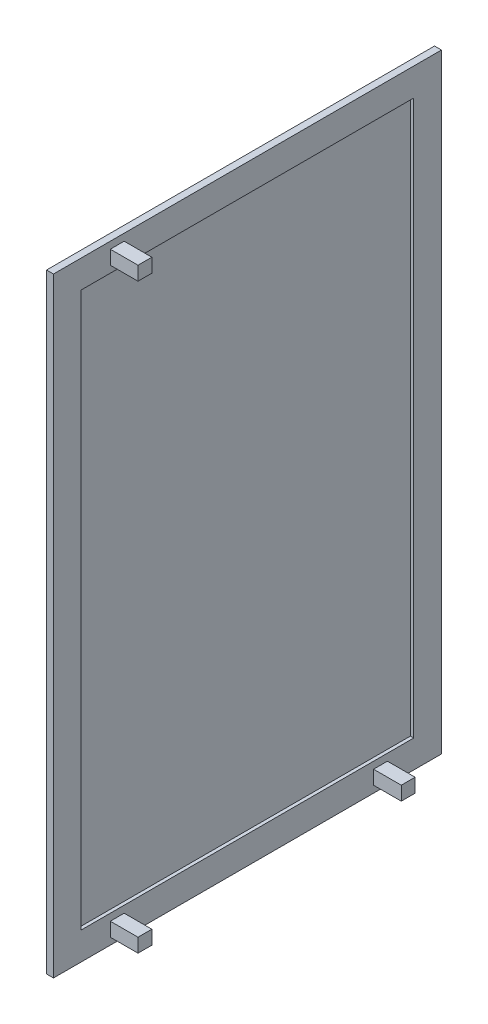
ISO-10303-21;
HEADER;
FILE_DESCRIPTION(('STEP AP214'),'2;1');
FILE_NAME('part.step','',(''),(''),'','','');
FILE_SCHEMA(('AUTOMOTIVE_DESIGN { 1 0 10303 214 1 1 1 1 }'));
ENDSEC;
DATA;
#1=APPLICATION_CONTEXT('core data for automotive mechanical design processes');
#2=APPLICATION_PROTOCOL_DEFINITION('international standard','automotive_design',2000,#1);
#3=PRODUCT_CONTEXT('',#1,'mechanical');
#4=PRODUCT('Part','Part','',(#3));
#5=PRODUCT_RELATED_PRODUCT_CATEGORY('part','',(#4));
#6=PRODUCT_DEFINITION_FORMATION('','',#4);
#7=PRODUCT_DEFINITION_CONTEXT('part definition',#1,'design');
#8=PRODUCT_DEFINITION('design','',#6,#7);
#9=PRODUCT_DEFINITION_SHAPE('','',#8);
#10=(LENGTH_UNIT() NAMED_UNIT(*) SI_UNIT(.MILLI.,.METRE.));
#11=(NAMED_UNIT(*) PLANE_ANGLE_UNIT() SI_UNIT($,.RADIAN.));
#12=(NAMED_UNIT(*) SI_UNIT($,.STERADIAN.) SOLID_ANGLE_UNIT());
#13=UNCERTAINTY_MEASURE_WITH_UNIT(LENGTH_MEASURE(1.E-05),#10,'distance_accuracy_value','');
#14=(GEOMETRIC_REPRESENTATION_CONTEXT(3) GLOBAL_UNCERTAINTY_ASSIGNED_CONTEXT((#13)) GLOBAL_UNIT_ASSIGNED_CONTEXT((#10,
#11,#12)) REPRESENTATION_CONTEXT('',''));
#15=CARTESIAN_POINT('',(0.,0.,0.));
#16=DIRECTION('',(0.,0.,1.));
#17=DIRECTION('',(1.,0.,0.));
#18=AXIS2_PLACEMENT_3D('',#15,#16,#17);
#19=CARTESIAN_POINT('',(1.25,0.,0.));
#20=DIRECTION('',(-1.,0.,0.));
#21=DIRECTION('',(0.,0.,1.));
#22=AXIS2_PLACEMENT_3D('',#19,#20,#21);
#23=PLANE('',#22);
#24=DIRECTION('',(0.,0.,-1.));
#25=VECTOR('',#24,1.);
#26=CARTESIAN_POINT('',(1.25,5.,-5.00000000000001));
#27=LINE('',#26,#25);
#28=CARTESIAN_POINT('',(1.25,5.,-5.00000000000001));
#29=VERTEX_POINT('',#28);
#30=CARTESIAN_POINT('',(1.25,5.,-65.));
#31=VERTEX_POINT('',#30);
#32=EDGE_CURVE('E199',#29,#31,#27,.T.);
#33=ORIENTED_EDGE('',*,*,#32,.F.);
#34=DIRECTION('',(0.,-1.,0.));
#35=VECTOR('',#34,1.);
#36=CARTESIAN_POINT('',(1.25,105.,-5.));
#37=LINE('',#36,#35);
#38=CARTESIAN_POINT('',(1.25,105.,-5.));
#39=VERTEX_POINT('',#38);
#40=EDGE_CURVE('E48',#39,#29,#37,.T.);
#41=ORIENTED_EDGE('',*,*,#40,.F.);
#42=DIRECTION('',(0.,0.,1.));
#43=VECTOR('',#42,1.);
#44=CARTESIAN_POINT('',(1.25,105.,-5.));
#45=LINE('',#44,#43);
#46=CARTESIAN_POINT('',(1.25,105.,-65.));
#47=VERTEX_POINT('',#46);
#48=EDGE_CURVE('E190',#47,#39,#45,.T.);
#49=ORIENTED_EDGE('',*,*,#48,.F.);
#50=DIRECTION('',(0.,1.,0.));
#51=VECTOR('',#50,1.);
#52=CARTESIAN_POINT('',(1.25,105.,-65.));
#53=LINE('',#52,#51);
#54=EDGE_CURVE('E193',#31,#47,#53,.T.);
#55=ORIENTED_EDGE('',*,*,#54,.F.);
#56=EDGE_LOOP('',(#33,#41,#49,#55));
#57=FACE_BOUND('',#56,.T.);
#58=DIRECTION('',(0.,-1.,0.));
#59=VECTOR('',#58,1.);
#60=CARTESIAN_POINT('',(1.25,3.75,-10.25));
#61=LINE('',#60,#59);
#62=CARTESIAN_POINT('',(1.25,3.75,-10.25));
#63=VERTEX_POINT('',#62);
#64=CARTESIAN_POINT('',(1.25,1.25,-10.25));
#65=VERTEX_POINT('',#64);
#66=EDGE_CURVE('E238',#63,#65,#61,.T.);
#67=ORIENTED_EDGE('',*,*,#66,.F.);
#68=DIRECTION('',(0.,0.,1.));
#69=VECTOR('',#68,1.);
#70=CARTESIAN_POINT('',(1.25,3.75,-10.25));
#71=LINE('',#70,#69);
#72=CARTESIAN_POINT('',(1.25,3.75,-12.75));
#73=VERTEX_POINT('',#72);
#74=EDGE_CURVE('E243',#73,#63,#71,.T.);
#75=ORIENTED_EDGE('',*,*,#74,.F.);
#76=DIRECTION('',(0.,1.,0.));
#77=VECTOR('',#76,1.);
#78=CARTESIAN_POINT('',(1.25,3.75,-12.75));
#79=LINE('',#78,#77);
#80=CARTESIAN_POINT('',(1.25,1.25,-12.75));
#81=VERTEX_POINT('',#80);
#82=EDGE_CURVE('E255',#81,#73,#79,.T.);
#83=ORIENTED_EDGE('',*,*,#82,.F.);
#84=DIRECTION('',(0.,0.,-1.));
#85=VECTOR('',#84,1.);
#86=CARTESIAN_POINT('',(1.25,1.25,-10.25));
#87=LINE('',#86,#85);
#88=EDGE_CURVE('E252',#65,#81,#87,.T.);
#89=ORIENTED_EDGE('',*,*,#88,.F.);
#90=EDGE_LOOP('',(#67,#75,#83,#89));
#91=FACE_BOUND('',#90,.T.);
#92=DIRECTION('',(0.,-1.,0.));
#93=VECTOR('',#92,1.);
#94=CARTESIAN_POINT('',(1.25,0.,0.));
#95=LINE('',#94,#93);
#96=CARTESIAN_POINT('',(1.25,110.,0.));
#97=VERTEX_POINT('',#96);
#98=CARTESIAN_POINT('',(1.25,0.,0.));
#99=VERTEX_POINT('',#98);
#100=EDGE_CURVE('E305',#97,#99,#95,.T.);
#101=ORIENTED_EDGE('',*,*,#100,.T.);
#102=DIRECTION('',(0.,0.,-1.));
#103=VECTOR('',#102,1.);
#104=CARTESIAN_POINT('',(1.25,0.,0.));
#105=LINE('',#104,#103);
#106=CARTESIAN_POINT('',(1.25,0.,-70.));
#107=VERTEX_POINT('',#106);
#108=EDGE_CURVE('E308',#99,#107,#105,.T.);
#109=ORIENTED_EDGE('',*,*,#108,.T.);
#110=DIRECTION('',(0.,1.,0.));
#111=VECTOR('',#110,1.);
#112=CARTESIAN_POINT('',(1.25,0.,-70.));
#113=LINE('',#112,#111);
#114=CARTESIAN_POINT('',(1.25,110.,-70.));
#115=VERTEX_POINT('',#114);
#116=EDGE_CURVE('E311',#107,#115,#113,.T.);
#117=ORIENTED_EDGE('',*,*,#116,.T.);
#118=DIRECTION('',(0.,0.,1.));
#119=VECTOR('',#118,1.);
#120=CARTESIAN_POINT('',(1.25,110.,0.));
#121=LINE('',#120,#119);
#122=EDGE_CURVE('E313',#115,#97,#121,.T.);
#123=ORIENTED_EDGE('',*,*,#122,.T.);
#124=EDGE_LOOP('',(#101,#109,#117,#123));
#125=FACE_BOUND('',#124,.T.);
#126=DIRECTION('',(0.,-1.,0.));
#127=VECTOR('',#126,1.);
#128=CARTESIAN_POINT('',(1.25,108.75,-10.25));
#129=LINE('',#128,#127);
#130=CARTESIAN_POINT('',(1.25,108.75,-10.25));
#131=VERTEX_POINT('',#130);
#132=CARTESIAN_POINT('',(1.25,106.25,-10.25));
#133=VERTEX_POINT('',#132);
#134=EDGE_CURVE('E271',#131,#133,#129,.T.);
#135=ORIENTED_EDGE('',*,*,#134,.F.);
#136=DIRECTION('',(0.,0.,1.));
#137=VECTOR('',#136,1.);
#138=CARTESIAN_POINT('',(1.25,108.75,-10.25));
#139=LINE('',#138,#137);
#140=CARTESIAN_POINT('',(1.25,108.75,-12.75));
#141=VERTEX_POINT('',#140);
#142=EDGE_CURVE('E276',#141,#131,#139,.T.);
#143=ORIENTED_EDGE('',*,*,#142,.F.);
#144=DIRECTION('',(0.,1.,0.));
#145=VECTOR('',#144,1.);
#146=CARTESIAN_POINT('',(1.25,108.75,-12.75));
#147=LINE('',#146,#145);
#148=CARTESIAN_POINT('',(1.25,106.25,-12.75));
#149=VERTEX_POINT('',#148);
#150=EDGE_CURVE('E288',#149,#141,#147,.T.);
#151=ORIENTED_EDGE('',*,*,#150,.F.);
#152=DIRECTION('',(0.,0.,-1.));
#153=VECTOR('',#152,1.);
#154=CARTESIAN_POINT('',(1.25,106.25,-10.25));
#155=LINE('',#154,#153);
#156=EDGE_CURVE('E285',#133,#149,#155,.T.);
#157=ORIENTED_EDGE('',*,*,#156,.F.);
#158=EDGE_LOOP('',(#135,#143,#151,#157));
#159=FACE_BOUND('',#158,.T.);
#160=DIRECTION('',(0.,-1.,0.));
#161=VECTOR('',#160,1.);
#162=CARTESIAN_POINT('',(1.25,3.75,-57.75));
#163=LINE('',#162,#161);
#164=CARTESIAN_POINT('',(1.25,3.75,-57.75));
#165=VERTEX_POINT('',#164);
#166=CARTESIAN_POINT('',(1.25,1.25,-57.75));
#167=VERTEX_POINT('',#166);
#168=EDGE_CURVE('E205',#165,#167,#163,.T.);
#169=ORIENTED_EDGE('',*,*,#168,.F.);
#170=DIRECTION('',(0.,0.,1.));
#171=VECTOR('',#170,1.);
#172=CARTESIAN_POINT('',(1.25,3.75,-57.75));
#173=LINE('',#172,#171);
#174=CARTESIAN_POINT('',(1.25,3.75,-60.25));
#175=VERTEX_POINT('',#174);
#176=EDGE_CURVE('E213',#175,#165,#173,.T.);
#177=ORIENTED_EDGE('',*,*,#176,.F.);
#178=DIRECTION('',(0.,1.,0.));
#179=VECTOR('',#178,1.);
#180=CARTESIAN_POINT('',(1.25,3.75,-60.25));
#181=LINE('',#180,#179);
#182=CARTESIAN_POINT('',(1.25,1.25,-60.25));
#183=VERTEX_POINT('',#182);
#184=EDGE_CURVE('E223',#183,#175,#181,.T.);
#185=ORIENTED_EDGE('',*,*,#184,.F.);
#186=DIRECTION('',(0.,0.,-1.));
#187=VECTOR('',#186,1.);
#188=CARTESIAN_POINT('',(1.25,1.25,-57.75));
#189=LINE('',#188,#187);
#190=EDGE_CURVE('E56',#167,#183,#189,.T.);
#191=ORIENTED_EDGE('',*,*,#190,.F.);
#192=EDGE_LOOP('',(#169,#177,#185,#191));
#193=FACE_BOUND('',#192,.T.);
#194=ADVANCED_FACE('F33',(#57,#91,#125,#159,#193),#23,.F.);
#195=CARTESIAN_POINT('',(1.25,0.,0.));
#196=DIRECTION('',(0.,0.,-1.));
#197=DIRECTION('',(-1.,0.,0.));
#198=AXIS2_PLACEMENT_3D('',#195,#196,#197);
#199=PLANE('',#198);
#200=DIRECTION('',(0.,-1.,0.));
#201=VECTOR('',#200,1.);
#202=CARTESIAN_POINT('',(0.,0.,0.));
#203=LINE('',#202,#201);
#204=CARTESIAN_POINT('',(0.,110.,0.));
#205=VERTEX_POINT('',#204);
#206=CARTESIAN_POINT('',(0.,0.,0.));
#207=VERTEX_POINT('',#206);
#208=EDGE_CURVE('E304',#205,#207,#203,.T.);
#209=ORIENTED_EDGE('',*,*,#208,.T.);
#210=DIRECTION('',(-1.,0.,0.));
#211=VECTOR('',#210,1.);
#212=CARTESIAN_POINT('',(1.25,0.,0.));
#213=LINE('',#212,#211);
#214=EDGE_CURVE('E11',#99,#207,#213,.T.);
#215=ORIENTED_EDGE('',*,*,#214,.F.);
#216=ORIENTED_EDGE('',*,*,#100,.F.);
#217=DIRECTION('',(-1.,0.,0.));
#218=VECTOR('',#217,1.);
#219=CARTESIAN_POINT('',(1.25,110.,0.));
#220=LINE('',#219,#218);
#221=EDGE_CURVE('E315',#97,#205,#220,.T.);
#222=ORIENTED_EDGE('',*,*,#221,.T.);
#223=EDGE_LOOP('',(#209,#215,#216,#222));
#224=FACE_BOUND('',#223,.T.);
#225=ADVANCED_FACE('F35',(#224),#199,.F.);
#226=CARTESIAN_POINT('',(1.25,0.,0.));
#227=DIRECTION('',(0.,1.,0.));
#228=DIRECTION('',(0.,0.,1.));
#229=AXIS2_PLACEMENT_3D('',#226,#227,#228);
#230=PLANE('',#229);
#231=DIRECTION('',(0.,0.,-1.));
#232=VECTOR('',#231,1.);
#233=CARTESIAN_POINT('',(0.,0.,0.));
#234=LINE('',#233,#232);
#235=CARTESIAN_POINT('',(0.,0.,-70.));
#236=VERTEX_POINT('',#235);
#237=EDGE_CURVE('E318',#207,#236,#234,.T.);
#238=ORIENTED_EDGE('',*,*,#237,.T.);
#239=DIRECTION('',(-1.,0.,0.));
#240=VECTOR('',#239,1.);
#241=CARTESIAN_POINT('',(1.25,0.,-70.));
#242=LINE('',#241,#240);
#243=EDGE_CURVE('E41',#107,#236,#242,.T.);
#244=ORIENTED_EDGE('',*,*,#243,.F.);
#245=ORIENTED_EDGE('',*,*,#108,.F.);
#246=ORIENTED_EDGE('',*,*,#214,.T.);
#247=EDGE_LOOP('',(#238,#244,#245,#246));
#248=FACE_BOUND('',#247,.T.);
#249=ADVANCED_FACE('F348',(#248),#230,.F.);
#250=CARTESIAN_POINT('',(1.25,0.,-70.));
#251=DIRECTION('',(0.,0.,1.));
#252=DIRECTION('',(1.,0.,0.));
#253=AXIS2_PLACEMENT_3D('',#250,#251,#252);
#254=PLANE('',#253);
#255=DIRECTION('',(0.,1.,0.));
#256=VECTOR('',#255,1.);
#257=CARTESIAN_POINT('',(0.,0.,-70.));
#258=LINE('',#257,#256);
#259=CARTESIAN_POINT('',(0.,110.,-70.));
#260=VERTEX_POINT('',#259);
#261=EDGE_CURVE('E320',#236,#260,#258,.T.);
#262=ORIENTED_EDGE('',*,*,#261,.T.);
#263=DIRECTION('',(-1.,0.,0.));
#264=VECTOR('',#263,1.);
#265=CARTESIAN_POINT('',(1.25,110.,-70.));
#266=LINE('',#265,#264);
#267=EDGE_CURVE('E325',#115,#260,#266,.T.);
#268=ORIENTED_EDGE('',*,*,#267,.F.);
#269=ORIENTED_EDGE('',*,*,#116,.F.);
#270=ORIENTED_EDGE('',*,*,#243,.T.);
#271=EDGE_LOOP('',(#262,#268,#269,#270));
#272=FACE_BOUND('',#271,.T.);
#273=ADVANCED_FACE('F332',(#272),#254,.F.);
#274=CARTESIAN_POINT('',(1.25,110.,0.));
#275=DIRECTION('',(0.,-1.,0.));
#276=DIRECTION('',(0.,0.,-1.));
#277=AXIS2_PLACEMENT_3D('',#274,#275,#276);
#278=PLANE('',#277);
#279=DIRECTION('',(0.,0.,1.));
#280=VECTOR('',#279,1.);
#281=CARTESIAN_POINT('',(0.,110.,0.));
#282=LINE('',#281,#280);
#283=EDGE_CURVE('E309',#260,#205,#282,.T.);
#284=ORIENTED_EDGE('',*,*,#283,.T.);
#285=ORIENTED_EDGE('',*,*,#221,.F.);
#286=ORIENTED_EDGE('',*,*,#122,.F.);
#287=ORIENTED_EDGE('',*,*,#267,.T.);
#288=EDGE_LOOP('',(#284,#285,#286,#287));
#289=FACE_BOUND('',#288,.T.);
#290=ADVANCED_FACE('F341',(#289),#278,.F.);
#291=CARTESIAN_POINT('',(0.,0.,0.));
#292=DIRECTION('',(-1.,0.,0.));
#293=DIRECTION('',(0.,0.,1.));
#294=AXIS2_PLACEMENT_3D('',#291,#292,#293);
#295=PLANE('',#294);
#296=ORIENTED_EDGE('',*,*,#208,.F.);
#297=ORIENTED_EDGE('',*,*,#283,.F.);
#298=ORIENTED_EDGE('',*,*,#261,.F.);
#299=ORIENTED_EDGE('',*,*,#237,.F.);
#300=EDGE_LOOP('',(#296,#297,#298,#299));
#301=FACE_BOUND('',#300,.T.);
#302=ADVANCED_FACE('F338',(#301),#295,.T.);
#303=CARTESIAN_POINT('',(6.25,108.75,-10.25));
#304=DIRECTION('',(0.,0.,-1.));
#305=DIRECTION('',(0.,1.,0.));
#306=AXIS2_PLACEMENT_3D('',#303,#304,#305);
#307=PLANE('',#306);
#308=ORIENTED_EDGE('',*,*,#134,.T.);
#309=DIRECTION('',(-1.,0.,0.));
#310=VECTOR('',#309,1.);
#311=CARTESIAN_POINT('',(6.25,106.25,-10.25));
#312=LINE('',#311,#310);
#313=CARTESIAN_POINT('',(6.25,106.25,-10.25));
#314=VERTEX_POINT('',#313);
#315=EDGE_CURVE('E301',#314,#133,#312,.T.);
#316=ORIENTED_EDGE('',*,*,#315,.F.);
#317=DIRECTION('',(0.,-1.,0.));
#318=VECTOR('',#317,1.);
#319=CARTESIAN_POINT('',(6.25,108.75,-10.25));
#320=LINE('',#319,#318);
#321=CARTESIAN_POINT('',(6.25,108.75,-10.25));
#322=VERTEX_POINT('',#321);
#323=EDGE_CURVE('E272',#322,#314,#320,.T.);
#324=ORIENTED_EDGE('',*,*,#323,.F.);
#325=DIRECTION('',(-1.,0.,0.));
#326=VECTOR('',#325,1.);
#327=CARTESIAN_POINT('',(6.25,108.75,-10.25));
#328=LINE('',#327,#326);
#329=EDGE_CURVE('E282',#322,#131,#328,.T.);
#330=ORIENTED_EDGE('',*,*,#329,.T.);
#331=EDGE_LOOP('',(#308,#316,#324,#330));
#332=FACE_BOUND('',#331,.T.);
#333=ADVANCED_FACE('F365',(#332),#307,.F.);
#334=CARTESIAN_POINT('',(6.25,106.25,-10.25));
#335=DIRECTION('',(0.,1.,0.));
#336=DIRECTION('',(0.,0.,1.));
#337=AXIS2_PLACEMENT_3D('',#334,#335,#336);
#338=PLANE('',#337);
#339=ORIENTED_EDGE('',*,*,#156,.T.);
#340=DIRECTION('',(-1.,0.,0.));
#341=VECTOR('',#340,1.);
#342=CARTESIAN_POINT('',(6.25,106.25,-12.75));
#343=LINE('',#342,#341);
#344=CARTESIAN_POINT('',(6.25,106.25,-12.75));
#345=VERTEX_POINT('',#344);
#346=EDGE_CURVE('E298',#345,#149,#343,.T.);
#347=ORIENTED_EDGE('',*,*,#346,.F.);
#348=DIRECTION('',(0.,0.,-1.));
#349=VECTOR('',#348,1.);
#350=CARTESIAN_POINT('',(6.25,106.25,-10.25));
#351=LINE('',#350,#349);
#352=EDGE_CURVE('E275',#314,#345,#351,.T.);
#353=ORIENTED_EDGE('',*,*,#352,.F.);
#354=ORIENTED_EDGE('',*,*,#315,.T.);
#355=EDGE_LOOP('',(#339,#347,#353,#354));
#356=FACE_BOUND('',#355,.T.);
#357=ADVANCED_FACE('F389',(#356),#338,.F.);
#358=CARTESIAN_POINT('',(6.25,108.75,-12.75));
#359=DIRECTION('',(0.,0.,1.));
#360=DIRECTION('',(1.,0.,0.));
#361=AXIS2_PLACEMENT_3D('',#358,#359,#360);
#362=PLANE('',#361);
#363=ORIENTED_EDGE('',*,*,#150,.T.);
#364=DIRECTION('',(-1.,0.,0.));
#365=VECTOR('',#364,1.);
#366=CARTESIAN_POINT('',(6.25,108.75,-12.75));
#367=LINE('',#366,#365);
#368=CARTESIAN_POINT('',(6.25,108.75,-12.75));
#369=VERTEX_POINT('',#368);
#370=EDGE_CURVE('E295',#369,#141,#367,.T.);
#371=ORIENTED_EDGE('',*,*,#370,.F.);
#372=DIRECTION('',(0.,1.,0.));
#373=VECTOR('',#372,1.);
#374=CARTESIAN_POINT('',(6.25,108.75,-12.75));
#375=LINE('',#374,#373);
#376=EDGE_CURVE('E278',#345,#369,#375,.T.);
#377=ORIENTED_EDGE('',*,*,#376,.F.);
#378=ORIENTED_EDGE('',*,*,#346,.T.);
#379=EDGE_LOOP('',(#363,#371,#377,#378));
#380=FACE_BOUND('',#379,.T.);
#381=ADVANCED_FACE('F395',(#380),#362,.F.);
#382=CARTESIAN_POINT('',(6.25,108.75,-10.25));
#383=DIRECTION('',(0.,-1.,0.));
#384=DIRECTION('',(0.,0.,-1.));
#385=AXIS2_PLACEMENT_3D('',#382,#383,#384);
#386=PLANE('',#385);
#387=ORIENTED_EDGE('',*,*,#142,.T.);
#388=ORIENTED_EDGE('',*,*,#329,.F.);
#389=DIRECTION('',(0.,0.,1.));
#390=VECTOR('',#389,1.);
#391=CARTESIAN_POINT('',(6.25,108.75,-10.25));
#392=LINE('',#391,#390);
#393=EDGE_CURVE('E280',#369,#322,#392,.T.);
#394=ORIENTED_EDGE('',*,*,#393,.F.);
#395=ORIENTED_EDGE('',*,*,#370,.T.);
#396=EDGE_LOOP('',(#387,#388,#394,#395));
#397=FACE_BOUND('',#396,.T.);
#398=ADVANCED_FACE('F402',(#397),#386,.F.);
#399=CARTESIAN_POINT('',(6.25,0.,0.));
#400=DIRECTION('',(1.,0.,0.));
#401=DIRECTION('',(0.,0.,-1.));
#402=AXIS2_PLACEMENT_3D('',#399,#400,#401);
#403=PLANE('',#402);
#404=ORIENTED_EDGE('',*,*,#323,.T.);
#405=ORIENTED_EDGE('',*,*,#352,.T.);
#406=ORIENTED_EDGE('',*,*,#376,.T.);
#407=ORIENTED_EDGE('',*,*,#393,.T.);
#408=EDGE_LOOP('',(#404,#405,#406,#407));
#409=FACE_BOUND('',#408,.T.);
#410=ADVANCED_FACE('F410',(#409),#403,.T.);
#411=CARTESIAN_POINT('',(6.25,3.75,-10.25));
#412=DIRECTION('',(0.,0.,-1.));
#413=DIRECTION('',(-1.,0.,0.));
#414=AXIS2_PLACEMENT_3D('',#411,#412,#413);
#415=PLANE('',#414);
#416=ORIENTED_EDGE('',*,*,#66,.T.);
#417=DIRECTION('',(-1.,0.,0.));
#418=VECTOR('',#417,1.);
#419=CARTESIAN_POINT('',(6.25,1.25,-10.25));
#420=LINE('',#419,#418);
#421=CARTESIAN_POINT('',(6.25,1.25,-10.25));
#422=VERTEX_POINT('',#421);
#423=EDGE_CURVE('E268',#422,#65,#420,.T.);
#424=ORIENTED_EDGE('',*,*,#423,.F.);
#425=DIRECTION('',(0.,-1.,0.));
#426=VECTOR('',#425,1.);
#427=CARTESIAN_POINT('',(6.25,3.75,-10.25));
#428=LINE('',#427,#426);
#429=CARTESIAN_POINT('',(6.25,3.75,-10.25));
#430=VERTEX_POINT('',#429);
#431=EDGE_CURVE('E239',#430,#422,#428,.T.);
#432=ORIENTED_EDGE('',*,*,#431,.F.);
#433=DIRECTION('',(-1.,0.,0.));
#434=VECTOR('',#433,1.);
#435=CARTESIAN_POINT('',(6.25,3.75,-10.25));
#436=LINE('',#435,#434);
#437=EDGE_CURVE('E249',#430,#63,#436,.T.);
#438=ORIENTED_EDGE('',*,*,#437,.T.);
#439=EDGE_LOOP('',(#416,#424,#432,#438));
#440=FACE_BOUND('',#439,.T.);
#441=ADVANCED_FACE('F418',(#440),#415,.F.);
#442=CARTESIAN_POINT('',(6.25,1.25,-10.25));
#443=DIRECTION('',(0.,1.,0.));
#444=DIRECTION('',(0.,0.,1.));
#445=AXIS2_PLACEMENT_3D('',#442,#443,#444);
#446=PLANE('',#445);
#447=ORIENTED_EDGE('',*,*,#88,.T.);
#448=DIRECTION('',(-1.,0.,0.));
#449=VECTOR('',#448,1.);
#450=CARTESIAN_POINT('',(6.25,1.25,-12.75));
#451=LINE('',#450,#449);
#452=CARTESIAN_POINT('',(6.25,1.25,-12.75));
#453=VERTEX_POINT('',#452);
#454=EDGE_CURVE('E265',#453,#81,#451,.T.);
#455=ORIENTED_EDGE('',*,*,#454,.F.);
#456=DIRECTION('',(0.,0.,-1.));
#457=VECTOR('',#456,1.);
#458=CARTESIAN_POINT('',(6.25,1.25,-10.25));
#459=LINE('',#458,#457);
#460=EDGE_CURVE('E242',#422,#453,#459,.T.);
#461=ORIENTED_EDGE('',*,*,#460,.F.);
#462=ORIENTED_EDGE('',*,*,#423,.T.);
#463=EDGE_LOOP('',(#447,#455,#461,#462));
#464=FACE_BOUND('',#463,.T.);
#465=ADVANCED_FACE('F426',(#464),#446,.F.);
#466=CARTESIAN_POINT('',(6.25,3.75,-12.75));
#467=DIRECTION('',(0.,0.,1.));
#468=DIRECTION('',(1.,0.,0.));
#469=AXIS2_PLACEMENT_3D('',#466,#467,#468);
#470=PLANE('',#469);
#471=ORIENTED_EDGE('',*,*,#82,.T.);
#472=DIRECTION('',(-1.,0.,0.));
#473=VECTOR('',#472,1.);
#474=CARTESIAN_POINT('',(6.25,3.75,-12.75));
#475=LINE('',#474,#473);
#476=CARTESIAN_POINT('',(6.25,3.75,-12.75));
#477=VERTEX_POINT('',#476);
#478=EDGE_CURVE('E262',#477,#73,#475,.T.);
#479=ORIENTED_EDGE('',*,*,#478,.F.);
#480=DIRECTION('',(0.,1.,0.));
#481=VECTOR('',#480,1.);
#482=CARTESIAN_POINT('',(6.25,3.75,-12.75));
#483=LINE('',#482,#481);
#484=EDGE_CURVE('E245',#453,#477,#483,.T.);
#485=ORIENTED_EDGE('',*,*,#484,.F.);
#486=ORIENTED_EDGE('',*,*,#454,.T.);
#487=EDGE_LOOP('',(#471,#479,#485,#486));
#488=FACE_BOUND('',#487,.T.);
#489=ADVANCED_FACE('F434',(#488),#470,.F.);
#490=CARTESIAN_POINT('',(6.25,3.75,-10.25));
#491=DIRECTION('',(0.,-1.,0.));
#492=DIRECTION('',(0.,0.,-1.));
#493=AXIS2_PLACEMENT_3D('',#490,#491,#492);
#494=PLANE('',#493);
#495=ORIENTED_EDGE('',*,*,#74,.T.);
#496=ORIENTED_EDGE('',*,*,#437,.F.);
#497=DIRECTION('',(0.,0.,1.));
#498=VECTOR('',#497,1.);
#499=CARTESIAN_POINT('',(6.25,3.75,-10.25));
#500=LINE('',#499,#498);
#501=EDGE_CURVE('E247',#477,#430,#500,.T.);
#502=ORIENTED_EDGE('',*,*,#501,.F.);
#503=ORIENTED_EDGE('',*,*,#478,.T.);
#504=EDGE_LOOP('',(#495,#496,#502,#503));
#505=FACE_BOUND('',#504,.T.);
#506=ADVANCED_FACE('F442',(#505),#494,.F.);
#507=CARTESIAN_POINT('',(6.25,0.,0.));
#508=DIRECTION('',(1.,0.,0.));
#509=DIRECTION('',(0.,0.,-1.));
#510=AXIS2_PLACEMENT_3D('',#507,#508,#509);
#511=PLANE('',#510);
#512=ORIENTED_EDGE('',*,*,#431,.T.);
#513=ORIENTED_EDGE('',*,*,#460,.T.);
#514=ORIENTED_EDGE('',*,*,#484,.T.);
#515=ORIENTED_EDGE('',*,*,#501,.T.);
#516=EDGE_LOOP('',(#512,#513,#514,#515));
#517=FACE_BOUND('',#516,.T.);
#518=ADVANCED_FACE('F450',(#517),#511,.T.);
#519=CARTESIAN_POINT('',(6.25,3.75,-57.75));
#520=DIRECTION('',(0.,0.,-1.));
#521=DIRECTION('',(-1.,0.,0.));
#522=AXIS2_PLACEMENT_3D('',#519,#520,#521);
#523=PLANE('',#522);
#524=ORIENTED_EDGE('',*,*,#168,.T.);
#525=DIRECTION('',(-1.,0.,0.));
#526=VECTOR('',#525,1.);
#527=CARTESIAN_POINT('',(6.25,1.25,-57.75));
#528=LINE('',#527,#526);
#529=CARTESIAN_POINT('',(6.25,1.25,-57.75));
#530=VERTEX_POINT('',#529);
#531=EDGE_CURVE('E236',#530,#167,#528,.T.);
#532=ORIENTED_EDGE('',*,*,#531,.F.);
#533=DIRECTION('',(0.,-1.,0.));
#534=VECTOR('',#533,1.);
#535=CARTESIAN_POINT('',(6.25,3.75,-57.75));
#536=LINE('',#535,#534);
#537=CARTESIAN_POINT('',(6.25,3.75,-57.75));
#538=VERTEX_POINT('',#537);
#539=EDGE_CURVE('E209',#538,#530,#536,.T.);
#540=ORIENTED_EDGE('',*,*,#539,.F.);
#541=DIRECTION('',(-1.,0.,0.));
#542=VECTOR('',#541,1.);
#543=CARTESIAN_POINT('',(6.25,3.75,-57.75));
#544=LINE('',#543,#542);
#545=EDGE_CURVE('E219',#538,#165,#544,.T.);
#546=ORIENTED_EDGE('',*,*,#545,.T.);
#547=EDGE_LOOP('',(#524,#532,#540,#546));
#548=FACE_BOUND('',#547,.T.);
#549=ADVANCED_FACE('F458',(#548),#523,.F.);
#550=CARTESIAN_POINT('',(6.25,1.25,-57.75));
#551=DIRECTION('',(0.,1.,0.));
#552=DIRECTION('',(0.,0.,1.));
#553=AXIS2_PLACEMENT_3D('',#550,#551,#552);
#554=PLANE('',#553);
#555=ORIENTED_EDGE('',*,*,#190,.T.);
#556=DIRECTION('',(-1.,0.,0.));
#557=VECTOR('',#556,1.);
#558=CARTESIAN_POINT('',(6.25,1.25,-60.25));
#559=LINE('',#558,#557);
#560=CARTESIAN_POINT('',(6.25,1.25,-60.25));
#561=VERTEX_POINT('',#560);
#562=EDGE_CURVE('E233',#561,#183,#559,.T.);
#563=ORIENTED_EDGE('',*,*,#562,.F.);
#564=DIRECTION('',(0.,0.,-1.));
#565=VECTOR('',#564,1.);
#566=CARTESIAN_POINT('',(6.25,1.25,-57.75));
#567=LINE('',#566,#565);
#568=EDGE_CURVE('E212',#530,#561,#567,.T.);
#569=ORIENTED_EDGE('',*,*,#568,.F.);
#570=ORIENTED_EDGE('',*,*,#531,.T.);
#571=EDGE_LOOP('',(#555,#563,#569,#570));
#572=FACE_BOUND('',#571,.T.);
#573=ADVANCED_FACE('F466',(#572),#554,.F.);
#574=CARTESIAN_POINT('',(6.25,3.75,-60.25));
#575=DIRECTION('',(0.,0.,1.));
#576=DIRECTION('',(1.,0.,0.));
#577=AXIS2_PLACEMENT_3D('',#574,#575,#576);
#578=PLANE('',#577);
#579=ORIENTED_EDGE('',*,*,#184,.T.);
#580=DIRECTION('',(-1.,0.,0.));
#581=VECTOR('',#580,1.);
#582=CARTESIAN_POINT('',(6.25,3.75,-60.25));
#583=LINE('',#582,#581);
#584=CARTESIAN_POINT('',(6.25,3.75,-60.25));
#585=VERTEX_POINT('',#584);
#586=EDGE_CURVE('E230',#585,#175,#583,.T.);
#587=ORIENTED_EDGE('',*,*,#586,.F.);
#588=DIRECTION('',(0.,1.,0.));
#589=VECTOR('',#588,1.);
#590=CARTESIAN_POINT('',(6.25,3.75,-60.25));
#591=LINE('',#590,#589);
#592=EDGE_CURVE('E215',#561,#585,#591,.T.);
#593=ORIENTED_EDGE('',*,*,#592,.F.);
#594=ORIENTED_EDGE('',*,*,#562,.T.);
#595=EDGE_LOOP('',(#579,#587,#593,#594));
#596=FACE_BOUND('',#595,.T.);
#597=ADVANCED_FACE('F474',(#596),#578,.F.);
#598=CARTESIAN_POINT('',(6.25,3.75,-57.75));
#599=DIRECTION('',(0.,-1.,0.));
#600=DIRECTION('',(0.,0.,-1.));
#601=AXIS2_PLACEMENT_3D('',#598,#599,#600);
#602=PLANE('',#601);
#603=ORIENTED_EDGE('',*,*,#176,.T.);
#604=ORIENTED_EDGE('',*,*,#545,.F.);
#605=DIRECTION('',(0.,0.,1.));
#606=VECTOR('',#605,1.);
#607=CARTESIAN_POINT('',(6.25,3.75,-57.75));
#608=LINE('',#607,#606);
#609=EDGE_CURVE('E217',#585,#538,#608,.T.);
#610=ORIENTED_EDGE('',*,*,#609,.F.);
#611=ORIENTED_EDGE('',*,*,#586,.T.);
#612=EDGE_LOOP('',(#603,#604,#610,#611));
#613=FACE_BOUND('',#612,.T.);
#614=ADVANCED_FACE('F482',(#613),#602,.F.);
#615=CARTESIAN_POINT('',(6.25,0.,0.));
#616=DIRECTION('',(1.,0.,0.));
#617=DIRECTION('',(0.,0.,-1.));
#618=AXIS2_PLACEMENT_3D('',#615,#616,#617);
#619=PLANE('',#618);
#620=ORIENTED_EDGE('',*,*,#539,.T.);
#621=ORIENTED_EDGE('',*,*,#568,.T.);
#622=ORIENTED_EDGE('',*,*,#592,.T.);
#623=ORIENTED_EDGE('',*,*,#609,.T.);
#624=EDGE_LOOP('',(#620,#621,#622,#623));
#625=FACE_BOUND('',#624,.T.);
#626=ADVANCED_FACE('F490',(#625),#619,.T.);
#627=CARTESIAN_POINT('',(0.65,105.,-5.));
#628=DIRECTION('',(0.,0.,1.));
#629=DIRECTION('',(0.,-1.,0.));
#630=AXIS2_PLACEMENT_3D('',#627,#628,#629);
#631=PLANE('',#630);
#632=ORIENTED_EDGE('',*,*,#40,.T.);
#633=DIRECTION('',(1.,0.,0.));
#634=VECTOR('',#633,1.);
#635=CARTESIAN_POINT('',(0.65,5.,-5.00000000000001));
#636=LINE('',#635,#634);
#637=CARTESIAN_POINT('',(0.65,5.,-5.00000000000001));
#638=VERTEX_POINT('',#637);
#639=EDGE_CURVE('E168',#638,#29,#636,.T.);
#640=ORIENTED_EDGE('',*,*,#639,.F.);
#641=DIRECTION('',(0.,-1.,0.));
#642=VECTOR('',#641,1.);
#643=CARTESIAN_POINT('',(0.65,105.,-5.));
#644=LINE('',#643,#642);
#645=CARTESIAN_POINT('',(0.65,105.,-5.));
#646=VERTEX_POINT('',#645);
#647=EDGE_CURVE('E172',#646,#638,#644,.T.);
#648=ORIENTED_EDGE('',*,*,#647,.F.);
#649=DIRECTION('',(1.,0.,0.));
#650=VECTOR('',#649,1.);
#651=CARTESIAN_POINT('',(0.65,105.,-5.));
#652=LINE('',#651,#650);
#653=EDGE_CURVE('E203',#646,#39,#652,.T.);
#654=ORIENTED_EDGE('',*,*,#653,.T.);
#655=EDGE_LOOP('',(#632,#640,#648,#654));
#656=FACE_BOUND('',#655,.T.);
#657=ADVANCED_FACE('F170',(#656),#631,.F.);
#658=CARTESIAN_POINT('',(0.65,105.,-5.));
#659=DIRECTION('',(0.,1.,0.));
#660=DIRECTION('',(0.,0.,1.));
#661=AXIS2_PLACEMENT_3D('',#658,#659,#660);
#662=PLANE('',#661);
#663=ORIENTED_EDGE('',*,*,#48,.T.);
#664=ORIENTED_EDGE('',*,*,#653,.F.);
#665=DIRECTION('',(0.,0.,1.));
#666=VECTOR('',#665,1.);
#667=CARTESIAN_POINT('',(0.65,105.,-5.));
#668=LINE('',#667,#666);
#669=CARTESIAN_POINT('',(0.65,105.,-65.));
#670=VERTEX_POINT('',#669);
#671=EDGE_CURVE('E178',#670,#646,#668,.T.);
#672=ORIENTED_EDGE('',*,*,#671,.F.);
#673=DIRECTION('',(1.,0.,0.));
#674=VECTOR('',#673,1.);
#675=CARTESIAN_POINT('',(0.65,105.,-65.));
#676=LINE('',#675,#674);
#677=EDGE_CURVE('E206',#670,#47,#676,.T.);
#678=ORIENTED_EDGE('',*,*,#677,.T.);
#679=EDGE_LOOP('',(#663,#664,#672,#678));
#680=FACE_BOUND('',#679,.T.);
#681=ADVANCED_FACE('F503',(#680),#662,.F.);
#682=CARTESIAN_POINT('',(0.65,105.,-65.));
#683=DIRECTION('',(0.,0.,-1.));
#684=DIRECTION('',(0.,1.,0.));
#685=AXIS2_PLACEMENT_3D('',#682,#683,#684);
#686=PLANE('',#685);
#687=ORIENTED_EDGE('',*,*,#54,.T.);
#688=ORIENTED_EDGE('',*,*,#677,.F.);
#689=DIRECTION('',(0.,1.,0.));
#690=VECTOR('',#689,1.);
#691=CARTESIAN_POINT('',(0.65,105.,-65.));
#692=LINE('',#691,#690);
#693=CARTESIAN_POINT('',(0.65,5.,-65.));
#694=VERTEX_POINT('',#693);
#695=EDGE_CURVE('E186',#694,#670,#692,.T.);
#696=ORIENTED_EDGE('',*,*,#695,.F.);
#697=DIRECTION('',(1.,0.,0.));
#698=VECTOR('',#697,1.);
#699=CARTESIAN_POINT('',(0.65,5.,-65.));
#700=LINE('',#699,#698);
#701=EDGE_CURVE('E177',#694,#31,#700,.T.);
#702=ORIENTED_EDGE('',*,*,#701,.T.);
#703=EDGE_LOOP('',(#687,#688,#696,#702));
#704=FACE_BOUND('',#703,.T.);
#705=ADVANCED_FACE('F510',(#704),#686,.F.);
#706=CARTESIAN_POINT('',(0.65,5.,-5.00000000000001));
#707=DIRECTION('',(0.,-1.,0.));
#708=DIRECTION('',(0.,0.,-1.));
#709=AXIS2_PLACEMENT_3D('',#706,#707,#708);
#710=PLANE('',#709);
#711=ORIENTED_EDGE('',*,*,#32,.T.);
#712=ORIENTED_EDGE('',*,*,#701,.F.);
#713=DIRECTION('',(0.,0.,-1.));
#714=VECTOR('',#713,1.);
#715=CARTESIAN_POINT('',(0.65,5.,-5.00000000000001));
#716=LINE('',#715,#714);
#717=EDGE_CURVE('E181',#638,#694,#716,.T.);
#718=ORIENTED_EDGE('',*,*,#717,.F.);
#719=ORIENTED_EDGE('',*,*,#639,.T.);
#720=EDGE_LOOP('',(#711,#712,#718,#719));
#721=FACE_BOUND('',#720,.T.);
#722=ADVANCED_FACE('F182',(#721),#710,.F.);
#723=CARTESIAN_POINT('',(0.65,0.,0.));
#724=DIRECTION('',(1.,0.,0.));
#725=DIRECTION('',(0.,0.,-1.));
#726=AXIS2_PLACEMENT_3D('',#723,#724,#725);
#727=PLANE('',#726);
#728=ORIENTED_EDGE('',*,*,#647,.T.);
#729=ORIENTED_EDGE('',*,*,#717,.T.);
#730=ORIENTED_EDGE('',*,*,#695,.T.);
#731=ORIENTED_EDGE('',*,*,#671,.T.);
#732=EDGE_LOOP('',(#728,#729,#730,#731));
#733=FACE_BOUND('',#732,.T.);
#734=ADVANCED_FACE('F188',(#733),#727,.T.);
#735=CLOSED_SHELL('',(#194,#225,#249,#273,#290,#302,#333,#357,#381,#398,#410,#441,#465,#489,
#506,#518,#549,#573,#597,#614,#626,#657,#681,#705,#722,#734));
#736=MANIFOLD_SOLID_BREP('B2',#735);
#737=ADVANCED_BREP_SHAPE_REPRESENTATION('',(#18,#736),#14);
#738=SHAPE_DEFINITION_REPRESENTATION(#9,#737);
ENDSEC;
END-ISO-10303-21;
